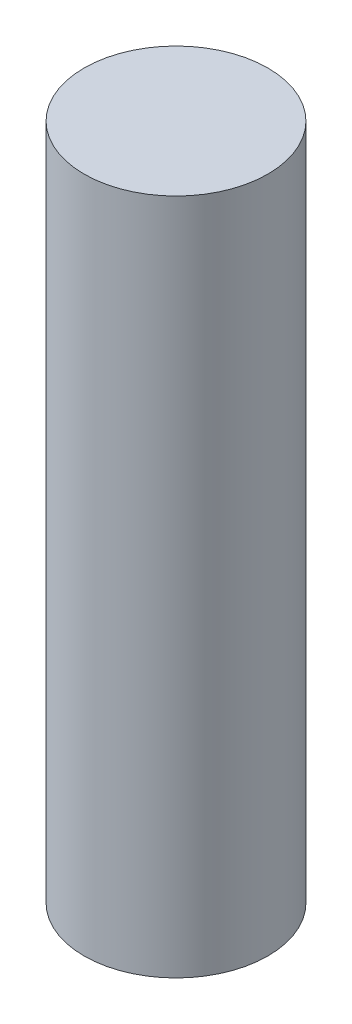
ISO-10303-21;
HEADER;
FILE_DESCRIPTION(('STEP AP214'),'2;1');
FILE_NAME('part.step','',(''),(''),'','','');
FILE_SCHEMA(('AUTOMOTIVE_DESIGN { 1 0 10303 214 1 1 1 1 }'));
ENDSEC;
DATA;
#1=APPLICATION_CONTEXT('core data for automotive mechanical design processes');
#2=APPLICATION_PROTOCOL_DEFINITION('international standard','automotive_design',2000,#1);
#3=PRODUCT_CONTEXT('',#1,'mechanical');
#4=PRODUCT('Part','Part','',(#3));
#5=PRODUCT_RELATED_PRODUCT_CATEGORY('part','',(#4));
#6=PRODUCT_DEFINITION_FORMATION('','',#4);
#7=PRODUCT_DEFINITION_CONTEXT('part definition',#1,'design');
#8=PRODUCT_DEFINITION('design','',#6,#7);
#9=PRODUCT_DEFINITION_SHAPE('','',#8);
#10=(LENGTH_UNIT() NAMED_UNIT(*) SI_UNIT(.MILLI.,.METRE.));
#11=(NAMED_UNIT(*) PLANE_ANGLE_UNIT() SI_UNIT($,.RADIAN.));
#12=(NAMED_UNIT(*) SI_UNIT($,.STERADIAN.) SOLID_ANGLE_UNIT());
#13=UNCERTAINTY_MEASURE_WITH_UNIT(LENGTH_MEASURE(1.E-05),#10,'distance_accuracy_value','');
#14=(GEOMETRIC_REPRESENTATION_CONTEXT(3) GLOBAL_UNCERTAINTY_ASSIGNED_CONTEXT((#13)) GLOBAL_UNIT_ASSIGNED_CONTEXT((#10,
#11,#12)) REPRESENTATION_CONTEXT('',''));
#15=CARTESIAN_POINT('',(0.,0.,0.));
#16=DIRECTION('',(0.,0.,1.));
#17=DIRECTION('',(1.,0.,0.));
#18=AXIS2_PLACEMENT_3D('',#15,#16,#17);
#19=CARTESIAN_POINT('',(0.,-1.,0.));
#20=DIRECTION('',(0.,1.,0.));
#21=DIRECTION('',(0.,0.,1.));
#22=AXIS2_PLACEMENT_3D('',#19,#20,#21);
#23=CYLINDRICAL_SURFACE('',#22,1.9);
#24=CARTESIAN_POINT('',(0.,-1.,0.));
#25=DIRECTION('',(0.,1.,0.));
#26=DIRECTION('',(0.,0.,1.));
#27=AXIS2_PLACEMENT_3D('',#24,#25,#26);
#28=CIRCLE('',#27,1.9);
#29=CARTESIAN_POINT('',(0.,-1.,1.9));
#30=VERTEX_POINT('',#29);
#31=EDGE_CURVE('E10',#30,#30,#28,.T.);
#32=ORIENTED_EDGE('',*,*,#31,.T.);
#33=EDGE_LOOP('',(#32));
#34=FACE_BOUND('',#33,.T.);
#35=CARTESIAN_POINT('',(0.,13.,0.));
#36=DIRECTION('',(0.,1.,0.));
#37=DIRECTION('',(0.,0.,1.));
#38=AXIS2_PLACEMENT_3D('',#35,#36,#37);
#39=CIRCLE('',#38,1.9);
#40=CARTESIAN_POINT('',(0.,13.,1.9));
#41=VERTEX_POINT('',#40);
#42=EDGE_CURVE('E47',#41,#41,#39,.T.);
#43=ORIENTED_EDGE('',*,*,#42,.F.);
#44=EDGE_LOOP('',(#43));
#45=FACE_BOUND('',#44,.T.);
#46=ADVANCED_FACE('F43',(#34,#45),#23,.T.);
#47=CARTESIAN_POINT('',(0.,-1.,0.));
#48=DIRECTION('',(0.,1.,0.));
#49=DIRECTION('',(0.,0.,1.));
#50=AXIS2_PLACEMENT_3D('',#47,#48,#49);
#51=PLANE('',#50);
#52=ORIENTED_EDGE('',*,*,#31,.F.);
#53=EDGE_LOOP('',(#52));
#54=FACE_BOUND('',#53,.T.);
#55=ADVANCED_FACE('F60',(#54),#51,.F.);
#56=CARTESIAN_POINT('',(0.,13.,0.));
#57=DIRECTION('',(0.,1.,0.));
#58=DIRECTION('',(0.,0.,1.));
#59=AXIS2_PLACEMENT_3D('',#56,#57,#58);
#60=PLANE('',#59);
#61=ORIENTED_EDGE('',*,*,#42,.T.);
#62=EDGE_LOOP('',(#61));
#63=FACE_BOUND('',#62,.T.);
#64=ADVANCED_FACE('F45',(#63),#60,.T.);
#65=CLOSED_SHELL('',(#46,#55,#64));
#66=MANIFOLD_SOLID_BREP('B2',#65);
#67=ADVANCED_BREP_SHAPE_REPRESENTATION('',(#18,#66),#14);
#68=SHAPE_DEFINITION_REPRESENTATION(#9,#67);
ENDSEC;
END-ISO-10303-21;
